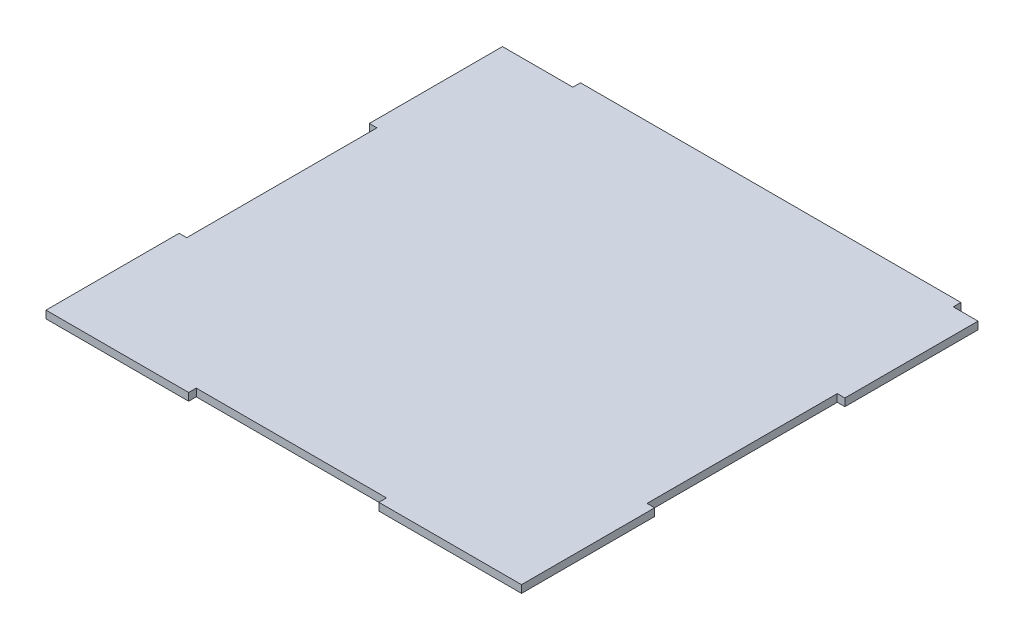
ISO-10303-21;
HEADER;
FILE_DESCRIPTION(('STEP AP214'),'2;1');
FILE_NAME('part.step','',(''),(''),'','','');
FILE_SCHEMA(('AUTOMOTIVE_DESIGN { 1 0 10303 214 1 1 1 1 }'));
ENDSEC;
DATA;
#1=APPLICATION_CONTEXT('core data for automotive mechanical design processes');
#2=APPLICATION_PROTOCOL_DEFINITION('international standard','automotive_design',2000,#1);
#3=PRODUCT_CONTEXT('',#1,'mechanical');
#4=PRODUCT('Part','Part','',(#3));
#5=PRODUCT_RELATED_PRODUCT_CATEGORY('part','',(#4));
#6=PRODUCT_DEFINITION_FORMATION('','',#4);
#7=PRODUCT_DEFINITION_CONTEXT('part definition',#1,'design');
#8=PRODUCT_DEFINITION('design','',#6,#7);
#9=PRODUCT_DEFINITION_SHAPE('','',#8);
#10=(LENGTH_UNIT() NAMED_UNIT(*) SI_UNIT(.MILLI.,.METRE.));
#11=(NAMED_UNIT(*) PLANE_ANGLE_UNIT() SI_UNIT($,.RADIAN.));
#12=(NAMED_UNIT(*) SI_UNIT($,.STERADIAN.) SOLID_ANGLE_UNIT());
#13=UNCERTAINTY_MEASURE_WITH_UNIT(LENGTH_MEASURE(1.E-05),#10,'distance_accuracy_value','');
#14=(GEOMETRIC_REPRESENTATION_CONTEXT(3) GLOBAL_UNCERTAINTY_ASSIGNED_CONTEXT((#13)) GLOBAL_UNIT_ASSIGNED_CONTEXT((#10,
#11,#12)) REPRESENTATION_CONTEXT('',''));
#15=CARTESIAN_POINT('',(0.,0.,0.));
#16=DIRECTION('',(0.,0.,1.));
#17=DIRECTION('',(1.,0.,0.));
#18=AXIS2_PLACEMENT_3D('',#15,#16,#17);
#19=CARTESIAN_POINT('',(0.,4.,0.));
#20=DIRECTION('',(0.,0.,-1.));
#21=DIRECTION('',(-1.,0.,0.));
#22=AXIS2_PLACEMENT_3D('',#19,#20,#21);
#23=PLANE('',#22);
#24=DIRECTION('',(1.,0.,0.));
#25=VECTOR('',#24,1.);
#26=CARTESIAN_POINT('',(0.,0.,0.));
#27=LINE('',#26,#25);
#28=CARTESIAN_POINT('',(0.,0.,0.));
#29=VERTEX_POINT('',#28);
#30=CARTESIAN_POINT('',(75.,0.,0.));
#31=VERTEX_POINT('',#30);
#32=EDGE_CURVE('E216',#29,#31,#27,.T.);
#33=ORIENTED_EDGE('',*,*,#32,.T.);
#34=DIRECTION('',(0.,-1.,0.));
#35=VECTOR('',#34,1.);
#36=CARTESIAN_POINT('',(75.,4.,0.));
#37=LINE('',#36,#35);
#38=CARTESIAN_POINT('',(75.,4.,0.));
#39=VERTEX_POINT('',#38);
#40=EDGE_CURVE('E11',#39,#31,#37,.T.);
#41=ORIENTED_EDGE('',*,*,#40,.F.);
#42=DIRECTION('',(1.,0.,0.));
#43=VECTOR('',#42,1.);
#44=CARTESIAN_POINT('',(0.,4.,0.));
#45=LINE('',#44,#43);
#46=CARTESIAN_POINT('',(0.,4.,0.));
#47=VERTEX_POINT('',#46);
#48=EDGE_CURVE('E268',#47,#39,#45,.T.);
#49=ORIENTED_EDGE('',*,*,#48,.F.);
#50=DIRECTION('',(0.,-1.,0.));
#51=VECTOR('',#50,1.);
#52=CARTESIAN_POINT('',(0.,4.,0.));
#53=LINE('',#52,#51);
#54=EDGE_CURVE('E62',#47,#29,#53,.T.);
#55=ORIENTED_EDGE('',*,*,#54,.T.);
#56=EDGE_LOOP('',(#33,#41,#49,#55));
#57=FACE_BOUND('',#56,.T.);
#58=ADVANCED_FACE('F46',(#57),#23,.F.);
#59=CARTESIAN_POINT('',(75.,4.,0.));
#60=DIRECTION('',(-1.,0.,0.));
#61=DIRECTION('',(0.,0.,1.));
#62=AXIS2_PLACEMENT_3D('',#59,#60,#61);
#63=PLANE('',#62);
#64=DIRECTION('',(0.,0.,-1.));
#65=VECTOR('',#64,1.);
#66=CARTESIAN_POINT('',(75.,0.,0.));
#67=LINE('',#66,#65);
#68=CARTESIAN_POINT('',(75.,0.,-4.));
#69=VERTEX_POINT('',#68);
#70=EDGE_CURVE('E218',#31,#69,#67,.T.);
#71=ORIENTED_EDGE('',*,*,#70,.T.);
#72=DIRECTION('',(0.,-1.,0.));
#73=VECTOR('',#72,1.);
#74=CARTESIAN_POINT('',(75.,4.,-4.));
#75=LINE('',#74,#73);
#76=CARTESIAN_POINT('',(75.,4.,-4.));
#77=VERTEX_POINT('',#76);
#78=EDGE_CURVE('E54',#77,#69,#75,.T.);
#79=ORIENTED_EDGE('',*,*,#78,.F.);
#80=DIRECTION('',(0.,0.,-1.));
#81=VECTOR('',#80,1.);
#82=CARTESIAN_POINT('',(75.,4.,0.));
#83=LINE('',#82,#81);
#84=EDGE_CURVE('E136',#39,#77,#83,.T.);
#85=ORIENTED_EDGE('',*,*,#84,.F.);
#86=ORIENTED_EDGE('',*,*,#40,.T.);
#87=EDGE_LOOP('',(#71,#79,#85,#86));
#88=FACE_BOUND('',#87,.T.);
#89=ADVANCED_FACE('F376',(#88),#63,.F.);
#90=CARTESIAN_POINT('',(75.,4.,-4.));
#91=DIRECTION('',(0.,0.,-1.));
#92=DIRECTION('',(-1.,0.,0.));
#93=AXIS2_PLACEMENT_3D('',#90,#91,#92);
#94=PLANE('',#93);
#95=DIRECTION('',(1.,0.,0.));
#96=VECTOR('',#95,1.);
#97=CARTESIAN_POINT('',(75.,0.,-4.));
#98=LINE('',#97,#96);
#99=CARTESIAN_POINT('',(175.,0.,-4.));
#100=VERTEX_POINT('',#99);
#101=EDGE_CURVE('E220',#69,#100,#98,.T.);
#102=ORIENTED_EDGE('',*,*,#101,.T.);
#103=DIRECTION('',(0.,-1.,0.));
#104=VECTOR('',#103,1.);
#105=CARTESIAN_POINT('',(175.,4.,-4.));
#106=LINE('',#105,#104);
#107=CARTESIAN_POINT('',(175.,4.,-4.));
#108=VERTEX_POINT('',#107);
#109=EDGE_CURVE('E300',#108,#100,#106,.T.);
#110=ORIENTED_EDGE('',*,*,#109,.F.);
#111=DIRECTION('',(1.,0.,0.));
#112=VECTOR('',#111,1.);
#113=CARTESIAN_POINT('',(75.,4.,-4.));
#114=LINE('',#113,#112);
#115=EDGE_CURVE('E307',#77,#108,#114,.T.);
#116=ORIENTED_EDGE('',*,*,#115,.F.);
#117=ORIENTED_EDGE('',*,*,#78,.T.);
#118=EDGE_LOOP('',(#102,#110,#116,#117));
#119=FACE_BOUND('',#118,.T.);
#120=ADVANCED_FACE('F305',(#119),#94,.F.);
#121=CARTESIAN_POINT('',(175.,4.,0.));
#122=DIRECTION('',(-1.,0.,0.));
#123=DIRECTION('',(0.,0.,1.));
#124=AXIS2_PLACEMENT_3D('',#121,#122,#123);
#125=PLANE('',#124);
#126=DIRECTION('',(0.,0.,-1.));
#127=VECTOR('',#126,1.);
#128=CARTESIAN_POINT('',(175.,0.,0.));
#129=LINE('',#128,#127);
#130=CARTESIAN_POINT('',(175.,0.,0.));
#131=VERTEX_POINT('',#130);
#132=EDGE_CURVE('E223',#131,#100,#129,.T.);
#133=ORIENTED_EDGE('',*,*,#132,.F.);
#134=DIRECTION('',(0.,-1.,0.));
#135=VECTOR('',#134,1.);
#136=CARTESIAN_POINT('',(175.,4.,0.));
#137=LINE('',#136,#135);
#138=CARTESIAN_POINT('',(175.,4.,0.));
#139=VERTEX_POINT('',#138);
#140=EDGE_CURVE('E298',#139,#131,#137,.T.);
#141=ORIENTED_EDGE('',*,*,#140,.F.);
#142=DIRECTION('',(0.,0.,-1.));
#143=VECTOR('',#142,1.);
#144=CARTESIAN_POINT('',(175.,4.,0.));
#145=LINE('',#144,#143);
#146=EDGE_CURVE('E318',#139,#108,#145,.T.);
#147=ORIENTED_EDGE('',*,*,#146,.T.);
#148=ORIENTED_EDGE('',*,*,#109,.T.);
#149=EDGE_LOOP('',(#133,#141,#147,#148));
#150=FACE_BOUND('',#149,.T.);
#151=ADVANCED_FACE('F314',(#150),#125,.T.);
#152=CARTESIAN_POINT('',(175.,4.,0.));
#153=DIRECTION('',(0.,0.,-1.));
#154=DIRECTION('',(-1.,0.,0.));
#155=AXIS2_PLACEMENT_3D('',#152,#153,#154);
#156=PLANE('',#155);
#157=DIRECTION('',(1.,0.,0.));
#158=VECTOR('',#157,1.);
#159=CARTESIAN_POINT('',(175.,0.,0.));
#160=LINE('',#159,#158);
#161=CARTESIAN_POINT('',(250.,0.,0.));
#162=VERTEX_POINT('',#161);
#163=EDGE_CURVE('E226',#131,#162,#160,.T.);
#164=ORIENTED_EDGE('',*,*,#163,.T.);
#165=DIRECTION('',(0.,-1.,0.));
#166=VECTOR('',#165,1.);
#167=CARTESIAN_POINT('',(250.,4.,0.));
#168=LINE('',#167,#166);
#169=CARTESIAN_POINT('',(250.,4.,0.));
#170=VERTEX_POINT('',#169);
#171=EDGE_CURVE('E295',#170,#162,#168,.T.);
#172=ORIENTED_EDGE('',*,*,#171,.F.);
#173=DIRECTION('',(1.,0.,0.));
#174=VECTOR('',#173,1.);
#175=CARTESIAN_POINT('',(175.,4.,0.));
#176=LINE('',#175,#174);
#177=EDGE_CURVE('E319',#139,#170,#176,.T.);
#178=ORIENTED_EDGE('',*,*,#177,.F.);
#179=ORIENTED_EDGE('',*,*,#140,.T.);
#180=EDGE_LOOP('',(#164,#172,#178,#179));
#181=FACE_BOUND('',#180,.T.);
#182=ADVANCED_FACE('F522',(#181),#156,.F.);
#183=CARTESIAN_POINT('',(250.,4.,0.));
#184=DIRECTION('',(-1.,0.,0.));
#185=DIRECTION('',(0.,0.,1.));
#186=AXIS2_PLACEMENT_3D('',#183,#184,#185);
#187=PLANE('',#186);
#188=DIRECTION('',(0.,0.,-1.));
#189=VECTOR('',#188,1.);
#190=CARTESIAN_POINT('',(250.,0.,0.));
#191=LINE('',#190,#189);
#192=CARTESIAN_POINT('',(250.,0.,-70.));
#193=VERTEX_POINT('',#192);
#194=EDGE_CURVE('E228',#162,#193,#191,.T.);
#195=ORIENTED_EDGE('',*,*,#194,.T.);
#196=DIRECTION('',(0.,-1.,0.));
#197=VECTOR('',#196,1.);
#198=CARTESIAN_POINT('',(250.,4.,-70.));
#199=LINE('',#198,#197);
#200=CARTESIAN_POINT('',(250.,4.,-70.));
#201=VERTEX_POINT('',#200);
#202=EDGE_CURVE('E292',#201,#193,#199,.T.);
#203=ORIENTED_EDGE('',*,*,#202,.F.);
#204=DIRECTION('',(0.,0.,-1.));
#205=VECTOR('',#204,1.);
#206=CARTESIAN_POINT('',(250.,4.,0.));
#207=LINE('',#206,#205);
#208=EDGE_CURVE('E321',#170,#201,#207,.T.);
#209=ORIENTED_EDGE('',*,*,#208,.F.);
#210=ORIENTED_EDGE('',*,*,#171,.T.);
#211=EDGE_LOOP('',(#195,#203,#209,#210));
#212=FACE_BOUND('',#211,.T.);
#213=ADVANCED_FACE('F512',(#212),#187,.F.);
#214=CARTESIAN_POINT('',(250.,4.,-70.));
#215=DIRECTION('',(0.,0.,1.));
#216=DIRECTION('',(1.,0.,0.));
#217=AXIS2_PLACEMENT_3D('',#214,#215,#216);
#218=PLANE('',#217);
#219=DIRECTION('',(-1.,0.,0.));
#220=VECTOR('',#219,1.);
#221=CARTESIAN_POINT('',(250.,0.,-70.));
#222=LINE('',#221,#220);
#223=CARTESIAN_POINT('',(246.,0.,-70.));
#224=VERTEX_POINT('',#223);
#225=EDGE_CURVE('E230',#193,#224,#222,.T.);
#226=ORIENTED_EDGE('',*,*,#225,.T.);
#227=DIRECTION('',(0.,-1.,0.));
#228=VECTOR('',#227,1.);
#229=CARTESIAN_POINT('',(246.,4.,-70.));
#230=LINE('',#229,#228);
#231=CARTESIAN_POINT('',(246.,4.,-70.));
#232=VERTEX_POINT('',#231);
#233=EDGE_CURVE('E290',#232,#224,#230,.T.);
#234=ORIENTED_EDGE('',*,*,#233,.F.);
#235=DIRECTION('',(-1.,0.,0.));
#236=VECTOR('',#235,1.);
#237=CARTESIAN_POINT('',(250.,4.,-70.));
#238=LINE('',#237,#236);
#239=EDGE_CURVE('E327',#201,#232,#238,.T.);
#240=ORIENTED_EDGE('',*,*,#239,.F.);
#241=ORIENTED_EDGE('',*,*,#202,.T.);
#242=EDGE_LOOP('',(#226,#234,#240,#241));
#243=FACE_BOUND('',#242,.T.);
#244=ADVANCED_FACE('F502',(#243),#218,.F.);
#245=CARTESIAN_POINT('',(246.,4.,-170.));
#246=DIRECTION('',(1.,0.,0.));
#247=DIRECTION('',(0.,0.,-1.));
#248=AXIS2_PLACEMENT_3D('',#245,#246,#247);
#249=PLANE('',#248);
#250=DIRECTION('',(0.,0.,1.));
#251=VECTOR('',#250,1.);
#252=CARTESIAN_POINT('',(246.,0.,-170.));
#253=LINE('',#252,#251);
#254=CARTESIAN_POINT('',(246.,0.,-170.));
#255=VERTEX_POINT('',#254);
#256=EDGE_CURVE('E233',#255,#224,#253,.T.);
#257=ORIENTED_EDGE('',*,*,#256,.F.);
#258=DIRECTION('',(0.,-1.,0.));
#259=VECTOR('',#258,1.);
#260=CARTESIAN_POINT('',(246.,4.,-170.));
#261=LINE('',#260,#259);
#262=CARTESIAN_POINT('',(246.,4.,-170.));
#263=VERTEX_POINT('',#262);
#264=EDGE_CURVE('E288',#263,#255,#261,.T.);
#265=ORIENTED_EDGE('',*,*,#264,.F.);
#266=DIRECTION('',(0.,0.,1.));
#267=VECTOR('',#266,1.);
#268=CARTESIAN_POINT('',(246.,4.,-170.));
#269=LINE('',#268,#267);
#270=EDGE_CURVE('E329',#263,#232,#269,.T.);
#271=ORIENTED_EDGE('',*,*,#270,.T.);
#272=ORIENTED_EDGE('',*,*,#233,.T.);
#273=EDGE_LOOP('',(#257,#265,#271,#272));
#274=FACE_BOUND('',#273,.T.);
#275=ADVANCED_FACE('F492',(#274),#249,.T.);
#276=CARTESIAN_POINT('',(250.,4.,-170.));
#277=DIRECTION('',(0.,0.,1.));
#278=DIRECTION('',(1.,0.,0.));
#279=AXIS2_PLACEMENT_3D('',#276,#277,#278);
#280=PLANE('',#279);
#281=DIRECTION('',(-1.,0.,0.));
#282=VECTOR('',#281,1.);
#283=CARTESIAN_POINT('',(250.,0.,-170.));
#284=LINE('',#283,#282);
#285=CARTESIAN_POINT('',(250.,0.,-170.));
#286=VERTEX_POINT('',#285);
#287=EDGE_CURVE('E236',#286,#255,#284,.T.);
#288=ORIENTED_EDGE('',*,*,#287,.F.);
#289=DIRECTION('',(0.,-1.,0.));
#290=VECTOR('',#289,1.);
#291=CARTESIAN_POINT('',(250.,4.,-170.));
#292=LINE('',#291,#290);
#293=CARTESIAN_POINT('',(250.,4.,-170.));
#294=VERTEX_POINT('',#293);
#295=EDGE_CURVE('E286',#294,#286,#292,.T.);
#296=ORIENTED_EDGE('',*,*,#295,.F.);
#297=DIRECTION('',(-1.,0.,0.));
#298=VECTOR('',#297,1.);
#299=CARTESIAN_POINT('',(250.,4.,-170.));
#300=LINE('',#299,#298);
#301=EDGE_CURVE('E332',#294,#263,#300,.T.);
#302=ORIENTED_EDGE('',*,*,#301,.T.);
#303=ORIENTED_EDGE('',*,*,#264,.T.);
#304=EDGE_LOOP('',(#288,#296,#302,#303));
#305=FACE_BOUND('',#304,.T.);
#306=ADVANCED_FACE('F482',(#305),#280,.T.);
#307=CARTESIAN_POINT('',(250.,4.,-170.));
#308=DIRECTION('',(-1.,0.,0.));
#309=DIRECTION('',(0.,0.,1.));
#310=AXIS2_PLACEMENT_3D('',#307,#308,#309);
#311=PLANE('',#310);
#312=DIRECTION('',(0.,0.,-1.));
#313=VECTOR('',#312,1.);
#314=CARTESIAN_POINT('',(250.,0.,-170.));
#315=LINE('',#314,#313);
#316=CARTESIAN_POINT('',(250.,0.,-240.));
#317=VERTEX_POINT('',#316);
#318=EDGE_CURVE('E239',#286,#317,#315,.T.);
#319=ORIENTED_EDGE('',*,*,#318,.T.);
#320=DIRECTION('',(0.,-1.,0.));
#321=VECTOR('',#320,1.);
#322=CARTESIAN_POINT('',(250.,4.,-240.));
#323=LINE('',#322,#321);
#324=CARTESIAN_POINT('',(250.,4.,-240.));
#325=VERTEX_POINT('',#324);
#326=EDGE_CURVE('E284',#325,#317,#323,.T.);
#327=ORIENTED_EDGE('',*,*,#326,.F.);
#328=DIRECTION('',(0.,0.,-1.));
#329=VECTOR('',#328,1.);
#330=CARTESIAN_POINT('',(250.,4.,-170.));
#331=LINE('',#330,#329);
#332=EDGE_CURVE('E335',#294,#325,#331,.T.);
#333=ORIENTED_EDGE('',*,*,#332,.F.);
#334=ORIENTED_EDGE('',*,*,#295,.T.);
#335=EDGE_LOOP('',(#319,#327,#333,#334));
#336=FACE_BOUND('',#335,.T.);
#337=ADVANCED_FACE('F472',(#336),#311,.F.);
#338=CARTESIAN_POINT('',(237.,4.,-240.));
#339=DIRECTION('',(0.,0.,-1.));
#340=DIRECTION('',(-1.,0.,0.));
#341=AXIS2_PLACEMENT_3D('',#338,#339,#340);
#342=PLANE('',#341);
#343=DIRECTION('',(1.,0.,0.));
#344=VECTOR('',#343,1.);
#345=CARTESIAN_POINT('',(237.,0.,-240.));
#346=LINE('',#345,#344);
#347=CARTESIAN_POINT('',(237.,0.,-240.));
#348=VERTEX_POINT('',#347);
#349=EDGE_CURVE('E242',#348,#317,#346,.T.);
#350=ORIENTED_EDGE('',*,*,#349,.F.);
#351=DIRECTION('',(0.,-1.,0.));
#352=VECTOR('',#351,1.);
#353=CARTESIAN_POINT('',(237.,4.,-240.));
#354=LINE('',#353,#352);
#355=CARTESIAN_POINT('',(237.,4.,-240.));
#356=VERTEX_POINT('',#355);
#357=EDGE_CURVE('E282',#356,#348,#354,.T.);
#358=ORIENTED_EDGE('',*,*,#357,.F.);
#359=DIRECTION('',(1.,0.,0.));
#360=VECTOR('',#359,1.);
#361=CARTESIAN_POINT('',(237.,4.,-240.));
#362=LINE('',#361,#360);
#363=EDGE_CURVE('E337',#356,#325,#362,.T.);
#364=ORIENTED_EDGE('',*,*,#363,.T.);
#365=ORIENTED_EDGE('',*,*,#326,.T.);
#366=EDGE_LOOP('',(#350,#358,#364,#365));
#367=FACE_BOUND('',#366,.T.);
#368=ADVANCED_FACE('F462',(#367),#342,.T.);
#369=CARTESIAN_POINT('',(237.,4.,-244.));
#370=DIRECTION('',(1.,0.,0.));
#371=DIRECTION('',(0.,0.,-1.));
#372=AXIS2_PLACEMENT_3D('',#369,#370,#371);
#373=PLANE('',#372);
#374=DIRECTION('',(0.,0.,1.));
#375=VECTOR('',#374,1.);
#376=CARTESIAN_POINT('',(237.,0.,-244.));
#377=LINE('',#376,#375);
#378=CARTESIAN_POINT('',(237.,0.,-244.));
#379=VERTEX_POINT('',#378);
#380=EDGE_CURVE('E245',#379,#348,#377,.T.);
#381=ORIENTED_EDGE('',*,*,#380,.F.);
#382=DIRECTION('',(0.,-1.,0.));
#383=VECTOR('',#382,1.);
#384=CARTESIAN_POINT('',(237.,4.,-244.));
#385=LINE('',#384,#383);
#386=CARTESIAN_POINT('',(237.,4.,-244.));
#387=VERTEX_POINT('',#386);
#388=EDGE_CURVE('E280',#387,#379,#385,.T.);
#389=ORIENTED_EDGE('',*,*,#388,.F.);
#390=DIRECTION('',(0.,0.,1.));
#391=VECTOR('',#390,1.);
#392=CARTESIAN_POINT('',(237.,4.,-244.));
#393=LINE('',#392,#391);
#394=EDGE_CURVE('E340',#387,#356,#393,.T.);
#395=ORIENTED_EDGE('',*,*,#394,.T.);
#396=ORIENTED_EDGE('',*,*,#357,.T.);
#397=EDGE_LOOP('',(#381,#389,#395,#396));
#398=FACE_BOUND('',#397,.T.);
#399=ADVANCED_FACE('F452',(#398),#373,.T.);
#400=CARTESIAN_POINT('',(37.0000000000001,4.,-244.));
#401=DIRECTION('',(0.,0.,-1.));
#402=DIRECTION('',(-1.,0.,0.));
#403=AXIS2_PLACEMENT_3D('',#400,#401,#402);
#404=PLANE('',#403);
#405=DIRECTION('',(1.,0.,0.));
#406=VECTOR('',#405,1.);
#407=CARTESIAN_POINT('',(37.0000000000001,0.,-244.));
#408=LINE('',#407,#406);
#409=CARTESIAN_POINT('',(37.0000000000001,0.,-244.));
#410=VERTEX_POINT('',#409);
#411=EDGE_CURVE('E248',#410,#379,#408,.T.);
#412=ORIENTED_EDGE('',*,*,#411,.F.);
#413=DIRECTION('',(0.,-1.,0.));
#414=VECTOR('',#413,1.);
#415=CARTESIAN_POINT('',(37.0000000000001,4.,-244.));
#416=LINE('',#415,#414);
#417=CARTESIAN_POINT('',(37.0000000000001,4.,-244.));
#418=VERTEX_POINT('',#417);
#419=EDGE_CURVE('E278',#418,#410,#416,.T.);
#420=ORIENTED_EDGE('',*,*,#419,.F.);
#421=DIRECTION('',(1.,0.,0.));
#422=VECTOR('',#421,1.);
#423=CARTESIAN_POINT('',(37.0000000000001,4.,-244.));
#424=LINE('',#423,#422);
#425=EDGE_CURVE('E343',#418,#387,#424,.T.);
#426=ORIENTED_EDGE('',*,*,#425,.T.);
#427=ORIENTED_EDGE('',*,*,#388,.T.);
#428=EDGE_LOOP('',(#412,#420,#426,#427));
#429=FACE_BOUND('',#428,.T.);
#430=ADVANCED_FACE('F442',(#429),#404,.T.);
#431=CARTESIAN_POINT('',(37.0000000000001,4.,-240.));
#432=DIRECTION('',(-1.,0.,0.));
#433=DIRECTION('',(0.,0.,1.));
#434=AXIS2_PLACEMENT_3D('',#431,#432,#433);
#435=PLANE('',#434);
#436=DIRECTION('',(0.,0.,-1.));
#437=VECTOR('',#436,1.);
#438=CARTESIAN_POINT('',(37.0000000000001,0.,-240.));
#439=LINE('',#438,#437);
#440=CARTESIAN_POINT('',(37.0000000000001,0.,-240.));
#441=VERTEX_POINT('',#440);
#442=EDGE_CURVE('E251',#441,#410,#439,.T.);
#443=ORIENTED_EDGE('',*,*,#442,.F.);
#444=DIRECTION('',(0.,-1.,0.));
#445=VECTOR('',#444,1.);
#446=CARTESIAN_POINT('',(37.0000000000001,4.,-240.));
#447=LINE('',#446,#445);
#448=CARTESIAN_POINT('',(37.0000000000001,4.,-240.));
#449=VERTEX_POINT('',#448);
#450=EDGE_CURVE('E276',#449,#441,#447,.T.);
#451=ORIENTED_EDGE('',*,*,#450,.F.);
#452=DIRECTION('',(0.,0.,-1.));
#453=VECTOR('',#452,1.);
#454=CARTESIAN_POINT('',(37.0000000000001,4.,-240.));
#455=LINE('',#454,#453);
#456=EDGE_CURVE('E346',#449,#418,#455,.T.);
#457=ORIENTED_EDGE('',*,*,#456,.T.);
#458=ORIENTED_EDGE('',*,*,#419,.T.);
#459=EDGE_LOOP('',(#443,#451,#457,#458));
#460=FACE_BOUND('',#459,.T.);
#461=ADVANCED_FACE('F433',(#460),#435,.T.);
#462=CARTESIAN_POINT('',(0.,4.,-240.));
#463=DIRECTION('',(0.,0.,-1.));
#464=DIRECTION('',(-1.,0.,0.));
#465=AXIS2_PLACEMENT_3D('',#462,#463,#464);
#466=PLANE('',#465);
#467=DIRECTION('',(1.,0.,0.));
#468=VECTOR('',#467,1.);
#469=CARTESIAN_POINT('',(0.,0.,-240.));
#470=LINE('',#469,#468);
#471=CARTESIAN_POINT('',(0.,0.,-240.));
#472=VERTEX_POINT('',#471);
#473=EDGE_CURVE('E254',#472,#441,#470,.T.);
#474=ORIENTED_EDGE('',*,*,#473,.F.);
#475=DIRECTION('',(0.,-1.,0.));
#476=VECTOR('',#475,1.);
#477=CARTESIAN_POINT('',(0.,4.,-240.));
#478=LINE('',#477,#476);
#479=CARTESIAN_POINT('',(0.,4.,-240.));
#480=VERTEX_POINT('',#479);
#481=EDGE_CURVE('E274',#480,#472,#478,.T.);
#482=ORIENTED_EDGE('',*,*,#481,.F.);
#483=DIRECTION('',(1.,0.,0.));
#484=VECTOR('',#483,1.);
#485=CARTESIAN_POINT('',(0.,4.,-240.));
#486=LINE('',#485,#484);
#487=EDGE_CURVE('E349',#480,#449,#486,.T.);
#488=ORIENTED_EDGE('',*,*,#487,.T.);
#489=ORIENTED_EDGE('',*,*,#450,.T.);
#490=EDGE_LOOP('',(#474,#482,#488,#489));
#491=FACE_BOUND('',#490,.T.);
#492=ADVANCED_FACE('F362',(#491),#466,.T.);
#493=CARTESIAN_POINT('',(0.,4.,-170.));
#494=DIRECTION('',(-1.,0.,0.));
#495=DIRECTION('',(0.,0.,1.));
#496=AXIS2_PLACEMENT_3D('',#493,#494,#495);
#497=PLANE('',#496);
#498=DIRECTION('',(0.,0.,-1.));
#499=VECTOR('',#498,1.);
#500=CARTESIAN_POINT('',(0.,0.,-170.));
#501=LINE('',#500,#499);
#502=CARTESIAN_POINT('',(0.,0.,-170.));
#503=VERTEX_POINT('',#502);
#504=EDGE_CURVE('E257',#503,#472,#501,.T.);
#505=ORIENTED_EDGE('',*,*,#504,.F.);
#506=DIRECTION('',(0.,-1.,0.));
#507=VECTOR('',#506,1.);
#508=CARTESIAN_POINT('',(0.,4.,-170.));
#509=LINE('',#508,#507);
#510=CARTESIAN_POINT('',(0.,4.,-170.));
#511=VERTEX_POINT('',#510);
#512=EDGE_CURVE('E272',#511,#503,#509,.T.);
#513=ORIENTED_EDGE('',*,*,#512,.F.);
#514=DIRECTION('',(0.,0.,-1.));
#515=VECTOR('',#514,1.);
#516=CARTESIAN_POINT('',(0.,4.,-170.));
#517=LINE('',#516,#515);
#518=EDGE_CURVE('E352',#511,#480,#517,.T.);
#519=ORIENTED_EDGE('',*,*,#518,.T.);
#520=ORIENTED_EDGE('',*,*,#481,.T.);
#521=EDGE_LOOP('',(#505,#513,#519,#520));
#522=FACE_BOUND('',#521,.T.);
#523=ADVANCED_FACE('F356',(#522),#497,.T.);
#524=CARTESIAN_POINT('',(0.,4.,-170.));
#525=DIRECTION('',(0.,0.,-1.));
#526=DIRECTION('',(-1.,0.,0.));
#527=AXIS2_PLACEMENT_3D('',#524,#525,#526);
#528=PLANE('',#527);
#529=DIRECTION('',(1.,0.,0.));
#530=VECTOR('',#529,1.);
#531=CARTESIAN_POINT('',(0.,0.,-170.));
#532=LINE('',#531,#530);
#533=CARTESIAN_POINT('',(3.99999999999999,0.,-170.));
#534=VERTEX_POINT('',#533);
#535=EDGE_CURVE('E260',#503,#534,#532,.T.);
#536=ORIENTED_EDGE('',*,*,#535,.T.);
#537=DIRECTION('',(0.,-1.,0.));
#538=VECTOR('',#537,1.);
#539=CARTESIAN_POINT('',(3.99999999999999,4.,-170.));
#540=LINE('',#539,#538);
#541=CARTESIAN_POINT('',(3.99999999999999,4.,-170.));
#542=VERTEX_POINT('',#541);
#543=EDGE_CURVE('E208',#542,#534,#540,.T.);
#544=ORIENTED_EDGE('',*,*,#543,.F.);
#545=DIRECTION('',(1.,0.,0.));
#546=VECTOR('',#545,1.);
#547=CARTESIAN_POINT('',(0.,4.,-170.));
#548=LINE('',#547,#546);
#549=EDGE_CURVE('E196',#511,#542,#548,.T.);
#550=ORIENTED_EDGE('',*,*,#549,.F.);
#551=ORIENTED_EDGE('',*,*,#512,.T.);
#552=EDGE_LOOP('',(#536,#544,#550,#551));
#553=FACE_BOUND('',#552,.T.);
#554=ADVANCED_FACE('F366',(#553),#528,.F.);
#555=CARTESIAN_POINT('',(3.99999999999999,4.,-170.));
#556=DIRECTION('',(1.,0.,0.));
#557=DIRECTION('',(0.,0.,-1.));
#558=AXIS2_PLACEMENT_3D('',#555,#556,#557);
#559=PLANE('',#558);
#560=DIRECTION('',(0.,0.,1.));
#561=VECTOR('',#560,1.);
#562=CARTESIAN_POINT('',(3.99999999999999,0.,-170.));
#563=LINE('',#562,#561);
#564=CARTESIAN_POINT('',(4.00000000000002,0.,-70.));
#565=VERTEX_POINT('',#564);
#566=EDGE_CURVE('E205',#534,#565,#563,.T.);
#567=ORIENTED_EDGE('',*,*,#566,.T.);
#568=DIRECTION('',(0.,-1.,0.));
#569=VECTOR('',#568,1.);
#570=CARTESIAN_POINT('',(4.00000000000002,4.,-70.));
#571=LINE('',#570,#569);
#572=CARTESIAN_POINT('',(4.00000000000002,4.,-70.));
#573=VERTEX_POINT('',#572);
#574=EDGE_CURVE('E202',#573,#565,#571,.T.);
#575=ORIENTED_EDGE('',*,*,#574,.F.);
#576=DIRECTION('',(0.,0.,1.));
#577=VECTOR('',#576,1.);
#578=CARTESIAN_POINT('',(3.99999999999999,4.,-170.));
#579=LINE('',#578,#577);
#580=EDGE_CURVE('E188',#542,#573,#579,.T.);
#581=ORIENTED_EDGE('',*,*,#580,.F.);
#582=ORIENTED_EDGE('',*,*,#543,.T.);
#583=EDGE_LOOP('',(#567,#575,#581,#582));
#584=FACE_BOUND('',#583,.T.);
#585=ADVANCED_FACE('F203',(#584),#559,.F.);
#586=CARTESIAN_POINT('',(0.,4.,-70.));
#587=DIRECTION('',(0.,0.,-1.));
#588=DIRECTION('',(-1.,0.,0.));
#589=AXIS2_PLACEMENT_3D('',#586,#587,#588);
#590=PLANE('',#589);
#591=DIRECTION('',(1.,0.,0.));
#592=VECTOR('',#591,1.);
#593=CARTESIAN_POINT('',(0.,0.,-70.));
#594=LINE('',#593,#592);
#595=CARTESIAN_POINT('',(0.,0.,-70.));
#596=VERTEX_POINT('',#595);
#597=EDGE_CURVE('E263',#596,#565,#594,.T.);
#598=ORIENTED_EDGE('',*,*,#597,.F.);
#599=DIRECTION('',(0.,-1.,0.));
#600=VECTOR('',#599,1.);
#601=CARTESIAN_POINT('',(0.,4.,-70.));
#602=LINE('',#601,#600);
#603=CARTESIAN_POINT('',(0.,4.,-70.));
#604=VERTEX_POINT('',#603);
#605=EDGE_CURVE('E124',#604,#596,#602,.T.);
#606=ORIENTED_EDGE('',*,*,#605,.F.);
#607=DIRECTION('',(1.,0.,0.));
#608=VECTOR('',#607,1.);
#609=CARTESIAN_POINT('',(0.,4.,-70.));
#610=LINE('',#609,#608);
#611=EDGE_CURVE('E193',#604,#573,#610,.T.);
#612=ORIENTED_EDGE('',*,*,#611,.T.);
#613=ORIENTED_EDGE('',*,*,#574,.T.);
#614=EDGE_LOOP('',(#598,#606,#612,#613));
#615=FACE_BOUND('',#614,.T.);
#616=ADVANCED_FACE('F210',(#615),#590,.T.);
#617=CARTESIAN_POINT('',(0.,4.,0.));
#618=DIRECTION('',(-1.,0.,0.));
#619=DIRECTION('',(0.,0.,1.));
#620=AXIS2_PLACEMENT_3D('',#617,#618,#619);
#621=PLANE('',#620);
#622=DIRECTION('',(0.,0.,-1.));
#623=VECTOR('',#622,1.);
#624=CARTESIAN_POINT('',(0.,0.,0.));
#625=LINE('',#624,#623);
#626=EDGE_CURVE('E265',#29,#596,#625,.T.);
#627=ORIENTED_EDGE('',*,*,#626,.F.);
#628=ORIENTED_EDGE('',*,*,#54,.F.);
#629=DIRECTION('',(0.,0.,-1.));
#630=VECTOR('',#629,1.);
#631=CARTESIAN_POINT('',(0.,4.,0.));
#632=LINE('',#631,#630);
#633=EDGE_CURVE('E211',#47,#604,#632,.T.);
#634=ORIENTED_EDGE('',*,*,#633,.T.);
#635=ORIENTED_EDGE('',*,*,#605,.T.);
#636=EDGE_LOOP('',(#627,#628,#634,#635));
#637=FACE_BOUND('',#636,.T.);
#638=ADVANCED_FACE('F381',(#637),#621,.T.);
#639=CARTESIAN_POINT('',(0.,4.,0.));
#640=DIRECTION('',(0.,1.,0.));
#641=DIRECTION('',(0.,0.,1.));
#642=AXIS2_PLACEMENT_3D('',#639,#640,#641);
#643=PLANE('',#642);
#644=ORIENTED_EDGE('',*,*,#48,.T.);
#645=ORIENTED_EDGE('',*,*,#84,.T.);
#646=ORIENTED_EDGE('',*,*,#115,.T.);
#647=ORIENTED_EDGE('',*,*,#146,.F.);
#648=ORIENTED_EDGE('',*,*,#177,.T.);
#649=ORIENTED_EDGE('',*,*,#208,.T.);
#650=ORIENTED_EDGE('',*,*,#239,.T.);
#651=ORIENTED_EDGE('',*,*,#270,.F.);
#652=ORIENTED_EDGE('',*,*,#301,.F.);
#653=ORIENTED_EDGE('',*,*,#332,.T.);
#654=ORIENTED_EDGE('',*,*,#363,.F.);
#655=ORIENTED_EDGE('',*,*,#394,.F.);
#656=ORIENTED_EDGE('',*,*,#425,.F.);
#657=ORIENTED_EDGE('',*,*,#456,.F.);
#658=ORIENTED_EDGE('',*,*,#487,.F.);
#659=ORIENTED_EDGE('',*,*,#518,.F.);
#660=ORIENTED_EDGE('',*,*,#549,.T.);
#661=ORIENTED_EDGE('',*,*,#580,.T.);
#662=ORIENTED_EDGE('',*,*,#611,.F.);
#663=ORIENTED_EDGE('',*,*,#633,.F.);
#664=EDGE_LOOP('',(#644,#645,#646,#647,#648,#649,#650,#651,#652,#653,#654,#655,#656,#657,#658,
#659,#660,#661,#662,#663));
#665=FACE_BOUND('',#664,.T.);
#666=ADVANCED_FACE('F190',(#665),#643,.T.);
#667=CARTESIAN_POINT('',(0.,0.,0.));
#668=DIRECTION('',(0.,1.,0.));
#669=DIRECTION('',(0.,0.,1.));
#670=AXIS2_PLACEMENT_3D('',#667,#668,#669);
#671=PLANE('',#670);
#672=ORIENTED_EDGE('',*,*,#32,.F.);
#673=ORIENTED_EDGE('',*,*,#626,.T.);
#674=ORIENTED_EDGE('',*,*,#597,.T.);
#675=ORIENTED_EDGE('',*,*,#566,.F.);
#676=ORIENTED_EDGE('',*,*,#535,.F.);
#677=ORIENTED_EDGE('',*,*,#504,.T.);
#678=ORIENTED_EDGE('',*,*,#473,.T.);
#679=ORIENTED_EDGE('',*,*,#442,.T.);
#680=ORIENTED_EDGE('',*,*,#411,.T.);
#681=ORIENTED_EDGE('',*,*,#380,.T.);
#682=ORIENTED_EDGE('',*,*,#349,.T.);
#683=ORIENTED_EDGE('',*,*,#318,.F.);
#684=ORIENTED_EDGE('',*,*,#287,.T.);
#685=ORIENTED_EDGE('',*,*,#256,.T.);
#686=ORIENTED_EDGE('',*,*,#225,.F.);
#687=ORIENTED_EDGE('',*,*,#194,.F.);
#688=ORIENTED_EDGE('',*,*,#163,.F.);
#689=ORIENTED_EDGE('',*,*,#132,.T.);
#690=ORIENTED_EDGE('',*,*,#101,.F.);
#691=ORIENTED_EDGE('',*,*,#70,.F.);
#692=EDGE_LOOP('',(#672,#673,#674,#675,#676,#677,#678,#679,#680,#681,#682,#683,#684,#685,#686,
#687,#688,#689,#690,#691));
#693=FACE_BOUND('',#692,.T.);
#694=ADVANCED_FACE('F309',(#693),#671,.F.);
#695=CLOSED_SHELL('',(#58,#89,#120,#151,#182,#213,#244,#275,#306,#337,#368,#399,#430,#461,#492,
#523,#554,#585,#616,#638,#666,#694));
#696=MANIFOLD_SOLID_BREP('B2',#695);
#697=ADVANCED_BREP_SHAPE_REPRESENTATION('',(#18,#696),#14);
#698=SHAPE_DEFINITION_REPRESENTATION(#9,#697);
ENDSEC;
END-ISO-10303-21;
